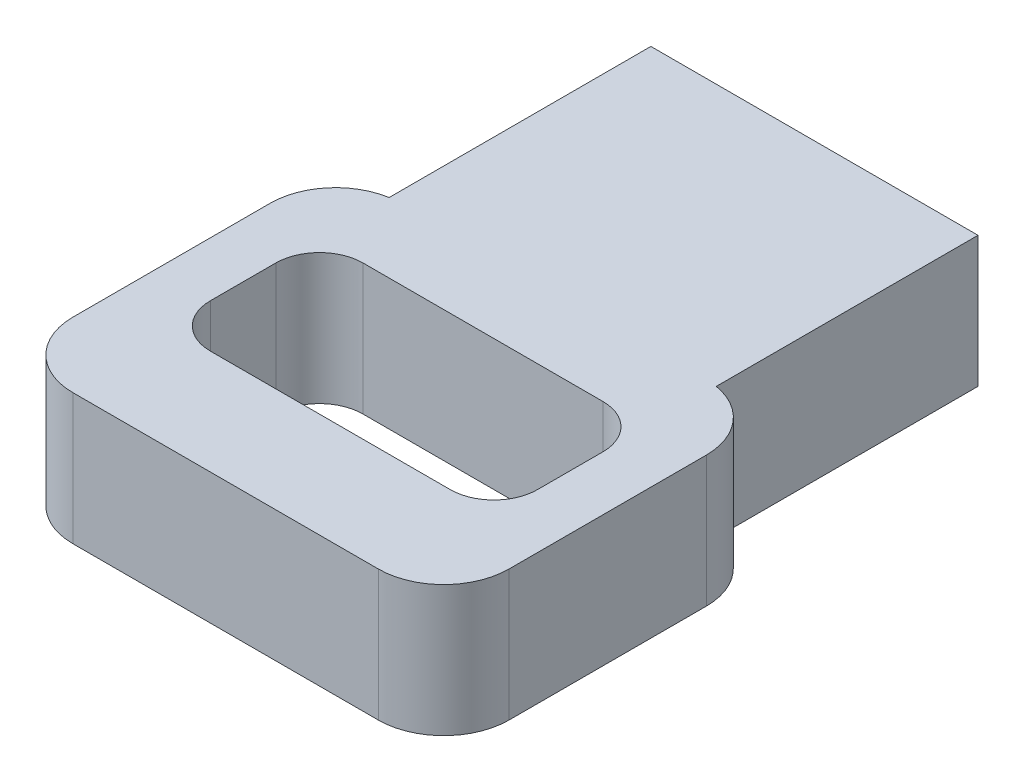
ISO-10303-21;
HEADER;
FILE_DESCRIPTION(('STEP AP214'),'2;1');
FILE_NAME('part.step','',(''),(''),'','','');
FILE_SCHEMA(('AUTOMOTIVE_DESIGN { 1 0 10303 214 1 1 1 1 }'));
ENDSEC;
DATA;
#1=APPLICATION_CONTEXT('core data for automotive mechanical design processes');
#2=APPLICATION_PROTOCOL_DEFINITION('international standard','automotive_design',2000,#1);
#3=PRODUCT_CONTEXT('',#1,'mechanical');
#4=PRODUCT('Part','Part','',(#3));
#5=PRODUCT_RELATED_PRODUCT_CATEGORY('part','',(#4));
#6=PRODUCT_DEFINITION_FORMATION('','',#4);
#7=PRODUCT_DEFINITION_CONTEXT('part definition',#1,'design');
#8=PRODUCT_DEFINITION('design','',#6,#7);
#9=PRODUCT_DEFINITION_SHAPE('','',#8);
#10=(LENGTH_UNIT() NAMED_UNIT(*) SI_UNIT(.MILLI.,.METRE.));
#11=(NAMED_UNIT(*) PLANE_ANGLE_UNIT() SI_UNIT($,.RADIAN.));
#12=(NAMED_UNIT(*) SI_UNIT($,.STERADIAN.) SOLID_ANGLE_UNIT());
#13=UNCERTAINTY_MEASURE_WITH_UNIT(LENGTH_MEASURE(1.E-05),#10,'distance_accuracy_value','');
#14=(GEOMETRIC_REPRESENTATION_CONTEXT(3) GLOBAL_UNCERTAINTY_ASSIGNED_CONTEXT((#13)) GLOBAL_UNIT_ASSIGNED_CONTEXT((#10,
#11,#12)) REPRESENTATION_CONTEXT('',''));
#15=CARTESIAN_POINT('',(0.,0.,0.));
#16=DIRECTION('',(0.,0.,1.));
#17=DIRECTION('',(1.,0.,0.));
#18=AXIS2_PLACEMENT_3D('',#15,#16,#17);
#19=CARTESIAN_POINT('',(-19.05,-7.62,30.48));
#20=DIRECTION('',(1.,0.,0.));
#21=DIRECTION('',(0.,0.,-1.));
#22=AXIS2_PLACEMENT_3D('',#19,#20,#21);
#23=PLANE('',#22);
#24=DIRECTION('',(0.,-1.,0.));
#25=VECTOR('',#24,1.);
#26=CARTESIAN_POINT('',(-19.05,-7.62,0.));
#27=LINE('',#26,#25);
#28=CARTESIAN_POINT('',(-19.05,7.62,0.));
#29=VERTEX_POINT('',#28);
#30=CARTESIAN_POINT('',(-19.05,-7.62,0.));
#31=VERTEX_POINT('',#30);
#32=EDGE_CURVE('E197',#29,#31,#27,.T.);
#33=ORIENTED_EDGE('',*,*,#32,.T.);
#34=DIRECTION('',(0.,0.,-1.));
#35=VECTOR('',#34,1.);
#36=CARTESIAN_POINT('',(-19.05,-7.62,30.48));
#37=LINE('',#36,#35);
#38=CARTESIAN_POINT('',(-19.05,-7.62,30.48));
#39=VERTEX_POINT('',#38);
#40=EDGE_CURVE('E205',#39,#31,#37,.T.);
#41=ORIENTED_EDGE('',*,*,#40,.F.);
#42=DIRECTION('',(0.,-1.,0.));
#43=VECTOR('',#42,1.);
#44=CARTESIAN_POINT('',(-19.05,-7.62,30.48));
#45=LINE('',#44,#43);
#46=CARTESIAN_POINT('',(-19.05,7.62,30.48));
#47=VERTEX_POINT('',#46);
#48=EDGE_CURVE('E188',#47,#39,#45,.T.);
#49=ORIENTED_EDGE('',*,*,#48,.F.);
#50=DIRECTION('',(0.,0.,-1.));
#51=VECTOR('',#50,1.);
#52=CARTESIAN_POINT('',(-19.05,7.62,30.48));
#53=LINE('',#52,#51);
#54=EDGE_CURVE('E184',#47,#29,#53,.T.);
#55=ORIENTED_EDGE('',*,*,#54,.T.);
#56=EDGE_LOOP('',(#33,#41,#49,#55));
#57=FACE_BOUND('',#56,.T.);
#58=ADVANCED_FACE('F43',(#57),#23,.F.);
#59=CARTESIAN_POINT('',(19.05,-7.62,30.48));
#60=DIRECTION('',(0.,1.,0.));
#61=DIRECTION('',(-1.,0.,0.));
#62=AXIS2_PLACEMENT_3D('',#59,#60,#61);
#63=PLANE('',#62);
#64=DIRECTION('',(1.,0.,0.));
#65=VECTOR('',#64,1.);
#66=CARTESIAN_POINT('',(-19.05,-7.62,38.604377682194));
#67=LINE('',#66,#65);
#68=CARTESIAN_POINT('',(-13.97,-7.62,38.604377682194));
#69=VERTEX_POINT('',#68);
#70=CARTESIAN_POINT('',(13.97,-7.62,38.604377682194));
#71=VERTEX_POINT('',#70);
#72=EDGE_CURVE('E554',#69,#71,#67,.T.);
#73=ORIENTED_EDGE('',*,*,#72,.F.);
#74=CARTESIAN_POINT('',(-13.97,-7.62,43.684377682194));
#75=DIRECTION('',(0.,1.,0.));
#76=DIRECTION('',(-1.,0.,0.));
#77=AXIS2_PLACEMENT_3D('',#74,#75,#76);
#78=CIRCLE('',#77,5.08);
#79=CARTESIAN_POINT('',(-19.05,-7.62,43.684377682194));
#80=VERTEX_POINT('',#79);
#81=EDGE_CURVE('E232',#69,#80,#78,.T.);
#82=ORIENTED_EDGE('',*,*,#81,.T.);
#83=DIRECTION('',(0.,0.,-1.));
#84=VECTOR('',#83,1.);
#85=CARTESIAN_POINT('',(-19.05,-7.62,56.384377682194));
#86=LINE('',#85,#84);
#87=CARTESIAN_POINT('',(-19.05,-7.62,51.304377682194));
#88=VERTEX_POINT('',#87);
#89=EDGE_CURVE('E548',#88,#80,#86,.T.);
#90=ORIENTED_EDGE('',*,*,#89,.F.);
#91=CARTESIAN_POINT('',(-13.97,-7.62,51.304377682194));
#92=DIRECTION('',(0.,1.,0.));
#93=DIRECTION('',(-1.,0.,0.));
#94=AXIS2_PLACEMENT_3D('',#91,#92,#93);
#95=CIRCLE('',#94,5.08);
#96=CARTESIAN_POINT('',(-13.97,-7.62,56.384377682194));
#97=VERTEX_POINT('',#96);
#98=EDGE_CURVE('E240',#88,#97,#95,.T.);
#99=ORIENTED_EDGE('',*,*,#98,.T.);
#100=DIRECTION('',(1.,0.,0.));
#101=VECTOR('',#100,1.);
#102=CARTESIAN_POINT('',(-19.05,-7.62,56.384377682194));
#103=LINE('',#102,#101);
#104=CARTESIAN_POINT('',(13.97,-7.62,56.384377682194));
#105=VERTEX_POINT('',#104);
#106=EDGE_CURVE('E562',#97,#105,#103,.T.);
#107=ORIENTED_EDGE('',*,*,#106,.T.);
#108=CARTESIAN_POINT('',(13.97,-7.62,51.304377682194));
#109=DIRECTION('',(0.,1.,0.));
#110=DIRECTION('',(-1.,0.,0.));
#111=AXIS2_PLACEMENT_3D('',#108,#109,#110);
#112=CIRCLE('',#111,5.08);
#113=CARTESIAN_POINT('',(19.05,-7.62,51.304377682194));
#114=VERTEX_POINT('',#113);
#115=EDGE_CURVE('E236',#105,#114,#112,.T.);
#116=ORIENTED_EDGE('',*,*,#115,.T.);
#117=DIRECTION('',(0.,0.,-1.));
#118=VECTOR('',#117,1.);
#119=CARTESIAN_POINT('',(19.05,-7.62,56.384377682194));
#120=LINE('',#119,#118);
#121=CARTESIAN_POINT('',(19.05,-7.62,43.684377682194));
#122=VERTEX_POINT('',#121);
#123=EDGE_CURVE('E557',#114,#122,#120,.T.);
#124=ORIENTED_EDGE('',*,*,#123,.T.);
#125=CARTESIAN_POINT('',(13.97,-7.62,43.684377682194));
#126=DIRECTION('',(0.,1.,0.));
#127=DIRECTION('',(-1.,0.,0.));
#128=AXIS2_PLACEMENT_3D('',#125,#126,#127);
#129=CIRCLE('',#128,5.08);
#130=EDGE_CURVE('E228',#122,#71,#129,.T.);
#131=ORIENTED_EDGE('',*,*,#130,.T.);
#132=EDGE_LOOP('',(#73,#82,#90,#99,#107,#116,#124,#131));
#133=FACE_BOUND('',#132,.T.);
#134=DIRECTION('',(0.,0.,-1.));
#135=VECTOR('',#134,1.);
#136=CARTESIAN_POINT('',(-25.4,-7.62,68.58));
#137=LINE('',#136,#135);
#138=CARTESIAN_POINT('',(-25.4,-7.62,60.96));
#139=VERTEX_POINT('',#138);
#140=CARTESIAN_POINT('',(-25.4,-7.62,37.9934213245365));
#141=VERTEX_POINT('',#140);
#142=EDGE_CURVE('E284',#139,#141,#137,.T.);
#143=ORIENTED_EDGE('',*,*,#142,.T.);
#144=CARTESIAN_POINT('',(-17.78,-7.62,37.9934213245365));
#145=DIRECTION('',(0.,1.,0.));
#146=DIRECTION('',(-1.,0.,0.));
#147=AXIS2_PLACEMENT_3D('',#144,#145,#146);
#148=CIRCLE('',#147,7.62);
#149=EDGE_CURVE('E254',#141,#39,#148,.F.);
#150=ORIENTED_EDGE('',*,*,#149,.T.);
#151=ORIENTED_EDGE('',*,*,#40,.T.);
#152=DIRECTION('',(1.,0.,0.));
#153=VECTOR('',#152,1.);
#154=CARTESIAN_POINT('',(19.05,-7.62,0.));
#155=LINE('',#154,#153);
#156=CARTESIAN_POINT('',(19.05,-7.62,0.));
#157=VERTEX_POINT('',#156);
#158=EDGE_CURVE('E200',#31,#157,#155,.T.);
#159=ORIENTED_EDGE('',*,*,#158,.T.);
#160=DIRECTION('',(0.,0.,-1.));
#161=VECTOR('',#160,1.);
#162=CARTESIAN_POINT('',(19.05,-7.62,30.48));
#163=LINE('',#162,#161);
#164=CARTESIAN_POINT('',(19.05,-7.62,30.48));
#165=VERTEX_POINT('',#164);
#166=EDGE_CURVE('E183',#165,#157,#163,.T.);
#167=ORIENTED_EDGE('',*,*,#166,.F.);
#168=CARTESIAN_POINT('',(17.78,-7.62,37.9934213245365));
#169=DIRECTION('',(0.,1.,0.));
#170=DIRECTION('',(-1.,0.,0.));
#171=AXIS2_PLACEMENT_3D('',#168,#169,#170);
#172=CIRCLE('',#171,7.62);
#173=CARTESIAN_POINT('',(25.4,-7.62,37.9934213245365));
#174=VERTEX_POINT('',#173);
#175=EDGE_CURVE('E187',#165,#174,#172,.F.);
#176=ORIENTED_EDGE('',*,*,#175,.T.);
#177=DIRECTION('',(0.,0.,-1.));
#178=VECTOR('',#177,1.);
#179=CARTESIAN_POINT('',(25.4,-7.62,68.58));
#180=LINE('',#179,#178);
#181=CARTESIAN_POINT('',(25.4,-7.62,60.96));
#182=VERTEX_POINT('',#181);
#183=EDGE_CURVE('E281',#182,#174,#180,.T.);
#184=ORIENTED_EDGE('',*,*,#183,.F.);
#185=CARTESIAN_POINT('',(17.78,-7.62,60.96));
#186=DIRECTION('',(0.,1.,0.));
#187=DIRECTION('',(-1.,0.,0.));
#188=AXIS2_PLACEMENT_3D('',#185,#186,#187);
#189=CIRCLE('',#188,7.62);
#190=CARTESIAN_POINT('',(17.78,-7.62,68.58));
#191=VERTEX_POINT('',#190);
#192=EDGE_CURVE('E251',#182,#191,#189,.F.);
#193=ORIENTED_EDGE('',*,*,#192,.T.);
#194=DIRECTION('',(1.,0.,0.));
#195=VECTOR('',#194,1.);
#196=CARTESIAN_POINT('',(-25.4,-7.62,68.58));
#197=LINE('',#196,#195);
#198=CARTESIAN_POINT('',(-17.78,-7.62,68.58));
#199=VERTEX_POINT('',#198);
#200=EDGE_CURVE('E270',#199,#191,#197,.T.);
#201=ORIENTED_EDGE('',*,*,#200,.F.);
#202=CARTESIAN_POINT('',(-17.78,-7.62,60.96));
#203=DIRECTION('',(0.,1.,0.));
#204=DIRECTION('',(-1.,0.,0.));
#205=AXIS2_PLACEMENT_3D('',#202,#203,#204);
#206=CIRCLE('',#205,7.62);
#207=EDGE_CURVE('E249',#199,#139,#206,.F.);
#208=ORIENTED_EDGE('',*,*,#207,.T.);
#209=EDGE_LOOP('',(#143,#150,#151,#159,#167,#176,#184,#193,#201,#208));
#210=FACE_BOUND('',#209,.T.);
#211=ADVANCED_FACE('F277',(#133,#210),#63,.F.);
#212=CARTESIAN_POINT('',(19.05,-7.62,30.48));
#213=DIRECTION('',(-1.,0.,0.));
#214=DIRECTION('',(0.,0.,1.));
#215=AXIS2_PLACEMENT_3D('',#212,#213,#214);
#216=PLANE('',#215);
#217=DIRECTION('',(0.,1.,0.));
#218=VECTOR('',#217,1.);
#219=CARTESIAN_POINT('',(19.05,-7.62,0.));
#220=LINE('',#219,#218);
#221=CARTESIAN_POINT('',(19.05,7.62,0.));
#222=VERTEX_POINT('',#221);
#223=EDGE_CURVE('E182',#157,#222,#220,.T.);
#224=ORIENTED_EDGE('',*,*,#223,.T.);
#225=DIRECTION('',(0.,0.,-1.));
#226=VECTOR('',#225,1.);
#227=CARTESIAN_POINT('',(19.05,7.62,30.48));
#228=LINE('',#227,#226);
#229=CARTESIAN_POINT('',(19.05,7.62,30.48));
#230=VERTEX_POINT('',#229);
#231=EDGE_CURVE('E170',#230,#222,#228,.T.);
#232=ORIENTED_EDGE('',*,*,#231,.F.);
#233=DIRECTION('',(0.,1.,0.));
#234=VECTOR('',#233,1.);
#235=CARTESIAN_POINT('',(19.05,-7.62,30.48));
#236=LINE('',#235,#234);
#237=EDGE_CURVE('E179',#165,#230,#236,.T.);
#238=ORIENTED_EDGE('',*,*,#237,.F.);
#239=ORIENTED_EDGE('',*,*,#166,.T.);
#240=EDGE_LOOP('',(#224,#232,#238,#239));
#241=FACE_BOUND('',#240,.T.);
#242=ADVANCED_FACE('F177',(#241),#216,.F.);
#243=CARTESIAN_POINT('',(19.05,7.62,30.48));
#244=DIRECTION('',(0.,-1.,0.));
#245=DIRECTION('',(1.,0.,0.));
#246=AXIS2_PLACEMENT_3D('',#243,#244,#245);
#247=PLANE('',#246);
#248=DIRECTION('',(1.,0.,0.));
#249=VECTOR('',#248,1.);
#250=CARTESIAN_POINT('',(-19.05,7.62,56.384377682194));
#251=LINE('',#250,#249);
#252=CARTESIAN_POINT('',(-13.97,7.62,56.384377682194));
#253=VERTEX_POINT('',#252);
#254=CARTESIAN_POINT('',(13.97,7.62,56.384377682194));
#255=VERTEX_POINT('',#254);
#256=EDGE_CURVE('E286',#253,#255,#251,.T.);
#257=ORIENTED_EDGE('',*,*,#256,.F.);
#258=CARTESIAN_POINT('',(-13.97,7.62,51.304377682194));
#259=DIRECTION('',(0.,-1.,0.));
#260=DIRECTION('',(1.,0.,0.));
#261=AXIS2_PLACEMENT_3D('',#258,#259,#260);
#262=CIRCLE('',#261,5.08);
#263=CARTESIAN_POINT('',(-19.05,7.62,51.304377682194));
#264=VERTEX_POINT('',#263);
#265=EDGE_CURVE('E242',#253,#264,#262,.T.);
#266=ORIENTED_EDGE('',*,*,#265,.T.);
#267=DIRECTION('',(0.,0.,-1.));
#268=VECTOR('',#267,1.);
#269=CARTESIAN_POINT('',(-19.05,7.62,56.384377682194));
#270=LINE('',#269,#268);
#271=CARTESIAN_POINT('',(-19.05,7.62,43.684377682194));
#272=VERTEX_POINT('',#271);
#273=EDGE_CURVE('E550',#264,#272,#270,.T.);
#274=ORIENTED_EDGE('',*,*,#273,.T.);
#275=CARTESIAN_POINT('',(-13.97,7.62,43.684377682194));
#276=DIRECTION('',(0.,-1.,0.));
#277=DIRECTION('',(1.,0.,0.));
#278=AXIS2_PLACEMENT_3D('',#275,#276,#277);
#279=CIRCLE('',#278,5.08);
#280=CARTESIAN_POINT('',(-13.97,7.62,38.604377682194));
#281=VERTEX_POINT('',#280);
#282=EDGE_CURVE('E234',#272,#281,#279,.T.);
#283=ORIENTED_EDGE('',*,*,#282,.T.);
#284=DIRECTION('',(1.,0.,0.));
#285=VECTOR('',#284,1.);
#286=CARTESIAN_POINT('',(-19.05,7.62,38.604377682194));
#287=LINE('',#286,#285);
#288=CARTESIAN_POINT('',(13.97,7.62000000000001,38.604377682194));
#289=VERTEX_POINT('',#288);
#290=EDGE_CURVE('E563',#281,#289,#287,.T.);
#291=ORIENTED_EDGE('',*,*,#290,.T.);
#292=CARTESIAN_POINT('',(13.97,7.62,43.684377682194));
#293=DIRECTION('',(0.,-1.,0.));
#294=DIRECTION('',(1.,0.,0.));
#295=AXIS2_PLACEMENT_3D('',#292,#293,#294);
#296=CIRCLE('',#295,5.08);
#297=CARTESIAN_POINT('',(19.05,7.62000000000001,43.684377682194));
#298=VERTEX_POINT('',#297);
#299=EDGE_CURVE('E230',#289,#298,#296,.T.);
#300=ORIENTED_EDGE('',*,*,#299,.T.);
#301=DIRECTION('',(0.,0.,-1.));
#302=VECTOR('',#301,1.);
#303=CARTESIAN_POINT('',(19.05,7.62000000000001,56.384377682194));
#304=LINE('',#303,#302);
#305=CARTESIAN_POINT('',(19.05,7.62000000000001,51.304377682194));
#306=VERTEX_POINT('',#305);
#307=EDGE_CURVE('E542',#306,#298,#304,.T.);
#308=ORIENTED_EDGE('',*,*,#307,.F.);
#309=CARTESIAN_POINT('',(13.97,7.62,51.304377682194));
#310=DIRECTION('',(0.,-1.,0.));
#311=DIRECTION('',(1.,0.,0.));
#312=AXIS2_PLACEMENT_3D('',#309,#310,#311);
#313=CIRCLE('',#312,5.08);
#314=EDGE_CURVE('E238',#306,#255,#313,.T.);
#315=ORIENTED_EDGE('',*,*,#314,.T.);
#316=EDGE_LOOP('',(#257,#266,#274,#283,#291,#300,#308,#315));
#317=FACE_BOUND('',#316,.T.);
#318=ORIENTED_EDGE('',*,*,#54,.F.);
#319=CARTESIAN_POINT('',(-17.78,7.62,37.9934213245365));
#320=DIRECTION('',(0.,-1.,0.));
#321=DIRECTION('',(1.,0.,0.));
#322=AXIS2_PLACEMENT_3D('',#319,#320,#321);
#323=CIRCLE('',#322,7.62);
#324=CARTESIAN_POINT('',(-25.4,7.62,37.9934213245365));
#325=VERTEX_POINT('',#324);
#326=EDGE_CURVE('E173',#47,#325,#323,.F.);
#327=ORIENTED_EDGE('',*,*,#326,.T.);
#328=DIRECTION('',(0.,0.,-1.));
#329=VECTOR('',#328,1.);
#330=CARTESIAN_POINT('',(-25.4,7.62,68.58));
#331=LINE('',#330,#329);
#332=CARTESIAN_POINT('',(-25.4,7.62,60.96));
#333=VERTEX_POINT('',#332);
#334=EDGE_CURVE('E291',#333,#325,#331,.T.);
#335=ORIENTED_EDGE('',*,*,#334,.F.);
#336=CARTESIAN_POINT('',(-17.78,7.62,60.96));
#337=DIRECTION('',(0.,-1.,0.));
#338=DIRECTION('',(1.,0.,0.));
#339=AXIS2_PLACEMENT_3D('',#336,#337,#338);
#340=CIRCLE('',#339,7.62);
#341=CARTESIAN_POINT('',(-17.78,7.62,68.58));
#342=VERTEX_POINT('',#341);
#343=EDGE_CURVE('E256',#333,#342,#340,.F.);
#344=ORIENTED_EDGE('',*,*,#343,.T.);
#345=DIRECTION('',(-1.,0.,0.));
#346=VECTOR('',#345,1.);
#347=CARTESIAN_POINT('',(-25.4,7.62,68.58));
#348=LINE('',#347,#346);
#349=CARTESIAN_POINT('',(17.78,7.62,68.58));
#350=VERTEX_POINT('',#349);
#351=EDGE_CURVE('E272',#350,#342,#348,.T.);
#352=ORIENTED_EDGE('',*,*,#351,.F.);
#353=CARTESIAN_POINT('',(17.78,7.62,60.96));
#354=DIRECTION('',(0.,-1.,0.));
#355=DIRECTION('',(1.,0.,0.));
#356=AXIS2_PLACEMENT_3D('',#353,#354,#355);
#357=CIRCLE('',#356,7.62);
#358=CARTESIAN_POINT('',(25.4,7.62,60.96));
#359=VERTEX_POINT('',#358);
#360=EDGE_CURVE('E66',#350,#359,#357,.F.);
#361=ORIENTED_EDGE('',*,*,#360,.T.);
#362=DIRECTION('',(0.,0.,-1.));
#363=VECTOR('',#362,1.);
#364=CARTESIAN_POINT('',(25.4,7.62,68.58));
#365=LINE('',#364,#363);
#366=CARTESIAN_POINT('',(25.4,7.62,37.9934213245365));
#367=VERTEX_POINT('',#366);
#368=EDGE_CURVE('E172',#359,#367,#365,.T.);
#369=ORIENTED_EDGE('',*,*,#368,.T.);
#370=CARTESIAN_POINT('',(17.78,7.62,37.9934213245365));
#371=DIRECTION('',(0.,-1.,0.));
#372=DIRECTION('',(1.,0.,0.));
#373=AXIS2_PLACEMENT_3D('',#370,#371,#372);
#374=CIRCLE('',#373,7.62);
#375=EDGE_CURVE('E58',#367,#230,#374,.F.);
#376=ORIENTED_EDGE('',*,*,#375,.T.);
#377=ORIENTED_EDGE('',*,*,#231,.T.);
#378=DIRECTION('',(-1.,0.,0.));
#379=VECTOR('',#378,1.);
#380=CARTESIAN_POINT('',(19.05,7.62,0.));
#381=LINE('',#380,#379);
#382=EDGE_CURVE('E193',#222,#29,#381,.T.);
#383=ORIENTED_EDGE('',*,*,#382,.T.);
#384=EDGE_LOOP('',(#318,#327,#335,#344,#352,#361,#369,#376,#377,#383));
#385=FACE_BOUND('',#384,.T.);
#386=ADVANCED_FACE('F169',(#317,#385),#247,.F.);
#387=CARTESIAN_POINT('',(0.,0.,0.));
#388=DIRECTION('',(0.,0.,1.));
#389=DIRECTION('',(1.,0.,0.));
#390=AXIS2_PLACEMENT_3D('',#387,#388,#389);
#391=PLANE('',#390);
#392=ORIENTED_EDGE('',*,*,#32,.F.);
#393=ORIENTED_EDGE('',*,*,#382,.F.);
#394=ORIENTED_EDGE('',*,*,#223,.F.);
#395=ORIENTED_EDGE('',*,*,#158,.F.);
#396=EDGE_LOOP('',(#392,#393,#394,#395));
#397=FACE_BOUND('',#396,.T.);
#398=ADVANCED_FACE('F306',(#397),#391,.F.);
#399=CARTESIAN_POINT('',(25.4,-7.62,68.58));
#400=DIRECTION('',(-1.,0.,0.));
#401=DIRECTION('',(0.,0.,1.));
#402=AXIS2_PLACEMENT_3D('',#399,#400,#401);
#403=PLANE('',#402);
#404=ORIENTED_EDGE('',*,*,#183,.T.);
#405=DIRECTION('',(0.,1.,0.));
#406=VECTOR('',#405,1.);
#407=CARTESIAN_POINT('',(25.4,-7.62,37.9934213245365));
#408=LINE('',#407,#406);
#409=EDGE_CURVE('E262',#174,#367,#408,.T.);
#410=ORIENTED_EDGE('',*,*,#409,.T.);
#411=ORIENTED_EDGE('',*,*,#368,.F.);
#412=DIRECTION('',(0.,1.,0.));
#413=VECTOR('',#412,1.);
#414=CARTESIAN_POINT('',(25.4,-7.62,60.96));
#415=LINE('',#414,#413);
#416=EDGE_CURVE('E260',#359,#182,#415,.F.);
#417=ORIENTED_EDGE('',*,*,#416,.T.);
#418=EDGE_LOOP('',(#404,#410,#411,#417));
#419=FACE_BOUND('',#418,.T.);
#420=ADVANCED_FACE('F308',(#419),#403,.F.);
#421=CARTESIAN_POINT('',(-25.4,-7.62,68.58));
#422=DIRECTION('',(1.,0.,0.));
#423=DIRECTION('',(0.,0.,-1.));
#424=AXIS2_PLACEMENT_3D('',#421,#422,#423);
#425=PLANE('',#424);
#426=ORIENTED_EDGE('',*,*,#334,.T.);
#427=DIRECTION('',(0.,-1.,0.));
#428=VECTOR('',#427,1.);
#429=CARTESIAN_POINT('',(-25.4,-7.62,37.9934213245365));
#430=LINE('',#429,#428);
#431=EDGE_CURVE('E246',#325,#141,#430,.T.);
#432=ORIENTED_EDGE('',*,*,#431,.T.);
#433=ORIENTED_EDGE('',*,*,#142,.F.);
#434=DIRECTION('',(0.,-1.,0.));
#435=VECTOR('',#434,1.);
#436=CARTESIAN_POINT('',(-25.4,-7.62,60.96));
#437=LINE('',#436,#435);
#438=EDGE_CURVE('E244',#139,#333,#437,.F.);
#439=ORIENTED_EDGE('',*,*,#438,.T.);
#440=EDGE_LOOP('',(#426,#432,#433,#439));
#441=FACE_BOUND('',#440,.T.);
#442=ADVANCED_FACE('F296',(#441),#425,.F.);
#443=CARTESIAN_POINT('',(0.,0.,68.58));
#444=DIRECTION('',(0.,0.,-1.));
#445=DIRECTION('',(-1.,0.,0.));
#446=AXIS2_PLACEMENT_3D('',#443,#444,#445);
#447=PLANE('',#446);
#448=ORIENTED_EDGE('',*,*,#200,.T.);
#449=DIRECTION('',(0.,1.,0.));
#450=VECTOR('',#449,1.);
#451=CARTESIAN_POINT('',(17.78,0.,68.58));
#452=LINE('',#451,#450);
#453=EDGE_CURVE('E11',#191,#350,#452,.T.);
#454=ORIENTED_EDGE('',*,*,#453,.T.);
#455=ORIENTED_EDGE('',*,*,#351,.T.);
#456=DIRECTION('',(0.,-1.,0.));
#457=VECTOR('',#456,1.);
#458=CARTESIAN_POINT('',(-17.78,0.,68.58));
#459=LINE('',#458,#457);
#460=EDGE_CURVE('E51',#342,#199,#459,.T.);
#461=ORIENTED_EDGE('',*,*,#460,.T.);
#462=EDGE_LOOP('',(#448,#454,#455,#461));
#463=FACE_BOUND('',#462,.T.);
#464=ADVANCED_FACE('F269',(#463),#447,.F.);
#465=CARTESIAN_POINT('',(-19.05,7.62,56.384377682194));
#466=DIRECTION('',(-1.,0.,0.));
#467=DIRECTION('',(0.,-1.,0.));
#468=AXIS2_PLACEMENT_3D('',#465,#466,#467);
#469=PLANE('',#468);
#470=ORIENTED_EDGE('',*,*,#89,.T.);
#471=DIRECTION('',(0.,-1.,0.));
#472=VECTOR('',#471,1.);
#473=CARTESIAN_POINT('',(-19.05,7.62,43.684377682194));
#474=LINE('',#473,#472);
#475=EDGE_CURVE('E221',#80,#272,#474,.F.);
#476=ORIENTED_EDGE('',*,*,#475,.T.);
#477=ORIENTED_EDGE('',*,*,#273,.F.);
#478=DIRECTION('',(0.,-1.,0.));
#479=VECTOR('',#478,1.);
#480=CARTESIAN_POINT('',(-19.05,7.62,51.304377682194));
#481=LINE('',#480,#479);
#482=EDGE_CURVE('E218',#264,#88,#481,.T.);
#483=ORIENTED_EDGE('',*,*,#482,.T.);
#484=EDGE_LOOP('',(#470,#476,#477,#483));
#485=FACE_BOUND('',#484,.T.);
#486=ADVANCED_FACE('F423',(#485),#469,.F.);
#487=CARTESIAN_POINT('',(-19.05,7.62,56.384377682194));
#488=DIRECTION('',(0.,0.,-1.));
#489=DIRECTION('',(-1.,0.,0.));
#490=AXIS2_PLACEMENT_3D('',#487,#488,#489);
#491=PLANE('',#490);
#492=ORIENTED_EDGE('',*,*,#256,.T.);
#493=DIRECTION('',(0.,-1.,0.));
#494=VECTOR('',#493,1.);
#495=CARTESIAN_POINT('',(13.97,-7.62,56.384377682194));
#496=LINE('',#495,#494);
#497=EDGE_CURVE('E225',#255,#105,#496,.T.);
#498=ORIENTED_EDGE('',*,*,#497,.T.);
#499=ORIENTED_EDGE('',*,*,#106,.F.);
#500=DIRECTION('',(0.,-1.,0.));
#501=VECTOR('',#500,1.);
#502=CARTESIAN_POINT('',(-13.97,7.62,56.384377682194));
#503=LINE('',#502,#501);
#504=EDGE_CURVE('E223',#97,#253,#503,.F.);
#505=ORIENTED_EDGE('',*,*,#504,.T.);
#506=EDGE_LOOP('',(#492,#498,#499,#505));
#507=FACE_BOUND('',#506,.T.);
#508=ADVANCED_FACE('F413',(#507),#491,.T.);
#509=CARTESIAN_POINT('',(19.05,7.62000000000001,56.384377682194));
#510=DIRECTION('',(-1.,0.,0.));
#511=DIRECTION('',(0.,0.,1.));
#512=AXIS2_PLACEMENT_3D('',#509,#510,#511);
#513=PLANE('',#512);
#514=ORIENTED_EDGE('',*,*,#307,.T.);
#515=DIRECTION('',(0.,-1.,0.));
#516=VECTOR('',#515,1.);
#517=CARTESIAN_POINT('',(19.05,7.62000000000001,43.684377682194));
#518=LINE('',#517,#516);
#519=EDGE_CURVE('E210',#298,#122,#518,.T.);
#520=ORIENTED_EDGE('',*,*,#519,.T.);
#521=ORIENTED_EDGE('',*,*,#123,.F.);
#522=DIRECTION('',(0.,-1.,0.));
#523=VECTOR('',#522,1.);
#524=CARTESIAN_POINT('',(19.05,7.62000000000001,51.304377682194));
#525=LINE('',#524,#523);
#526=EDGE_CURVE('E208',#114,#306,#525,.F.);
#527=ORIENTED_EDGE('',*,*,#526,.T.);
#528=EDGE_LOOP('',(#514,#520,#521,#527));
#529=FACE_BOUND('',#528,.T.);
#530=ADVANCED_FACE('F403',(#529),#513,.T.);
#531=CARTESIAN_POINT('',(-19.05,7.62,38.604377682194));
#532=DIRECTION('',(0.,0.,-1.));
#533=DIRECTION('',(-1.,0.,0.));
#534=AXIS2_PLACEMENT_3D('',#531,#532,#533);
#535=PLANE('',#534);
#536=ORIENTED_EDGE('',*,*,#72,.T.);
#537=DIRECTION('',(0.,-1.,0.));
#538=VECTOR('',#537,1.);
#539=CARTESIAN_POINT('',(13.97,7.62,38.604377682194));
#540=LINE('',#539,#538);
#541=EDGE_CURVE('E216',#71,#289,#540,.F.);
#542=ORIENTED_EDGE('',*,*,#541,.T.);
#543=ORIENTED_EDGE('',*,*,#290,.F.);
#544=DIRECTION('',(0.,-1.,0.));
#545=VECTOR('',#544,1.);
#546=CARTESIAN_POINT('',(-13.97,-7.62,38.604377682194));
#547=LINE('',#546,#545);
#548=EDGE_CURVE('E213',#281,#69,#547,.T.);
#549=ORIENTED_EDGE('',*,*,#548,.T.);
#550=EDGE_LOOP('',(#536,#542,#543,#549));
#551=FACE_BOUND('',#550,.T.);
#552=ADVANCED_FACE('F329',(#551),#535,.F.);
#553=CARTESIAN_POINT('',(13.97,7.62,43.684377682194));
#554=DIRECTION('',(0.,-1.,0.));
#555=DIRECTION('',(1.,0.,0.));
#556=AXIS2_PLACEMENT_3D('',#553,#554,#555);
#557=CYLINDRICAL_SURFACE('',#556,5.08);
#558=ORIENTED_EDGE('',*,*,#299,.F.);
#559=ORIENTED_EDGE('',*,*,#541,.F.);
#560=ORIENTED_EDGE('',*,*,#130,.F.);
#561=ORIENTED_EDGE('',*,*,#519,.F.);
#562=EDGE_LOOP('',(#558,#559,#560,#561));
#563=FACE_BOUND('',#562,.T.);
#564=ADVANCED_FACE('F325',(#563),#557,.F.);
#565=CARTESIAN_POINT('',(-13.97,7.62,43.684377682194));
#566=DIRECTION('',(0.,1.,0.));
#567=DIRECTION('',(-1.,0.,0.));
#568=AXIS2_PLACEMENT_3D('',#565,#566,#567);
#569=CYLINDRICAL_SURFACE('',#568,5.08);
#570=ORIENTED_EDGE('',*,*,#282,.F.);
#571=ORIENTED_EDGE('',*,*,#475,.F.);
#572=ORIENTED_EDGE('',*,*,#81,.F.);
#573=ORIENTED_EDGE('',*,*,#548,.F.);
#574=EDGE_LOOP('',(#570,#571,#572,#573));
#575=FACE_BOUND('',#574,.T.);
#576=ADVANCED_FACE('F328',(#575),#569,.F.);
#577=CARTESIAN_POINT('',(13.97,7.62,51.304377682194));
#578=DIRECTION('',(0.,1.,0.));
#579=DIRECTION('',(-1.,0.,0.));
#580=AXIS2_PLACEMENT_3D('',#577,#578,#579);
#581=CYLINDRICAL_SURFACE('',#580,5.08);
#582=ORIENTED_EDGE('',*,*,#314,.F.);
#583=ORIENTED_EDGE('',*,*,#526,.F.);
#584=ORIENTED_EDGE('',*,*,#115,.F.);
#585=ORIENTED_EDGE('',*,*,#497,.F.);
#586=EDGE_LOOP('',(#582,#583,#584,#585));
#587=FACE_BOUND('',#586,.T.);
#588=ADVANCED_FACE('F333',(#587),#581,.F.);
#589=CARTESIAN_POINT('',(-13.97,7.62,51.304377682194));
#590=DIRECTION('',(0.,-1.,0.));
#591=DIRECTION('',(1.,0.,0.));
#592=AXIS2_PLACEMENT_3D('',#589,#590,#591);
#593=CYLINDRICAL_SURFACE('',#592,5.08);
#594=ORIENTED_EDGE('',*,*,#265,.F.);
#595=ORIENTED_EDGE('',*,*,#504,.F.);
#596=ORIENTED_EDGE('',*,*,#98,.F.);
#597=ORIENTED_EDGE('',*,*,#482,.F.);
#598=EDGE_LOOP('',(#594,#595,#596,#597));
#599=FACE_BOUND('',#598,.T.);
#600=ADVANCED_FACE('F337',(#599),#593,.F.);
#601=CARTESIAN_POINT('',(-17.78,0.,37.9934213245365));
#602=DIRECTION('',(0.,-1.,0.));
#603=DIRECTION('',(0.,0.,-1.));
#604=AXIS2_PLACEMENT_3D('',#601,#602,#603);
#605=CYLINDRICAL_SURFACE('',#604,7.62);
#606=ORIENTED_EDGE('',*,*,#326,.F.);
#607=ORIENTED_EDGE('',*,*,#48,.T.);
#608=ORIENTED_EDGE('',*,*,#149,.F.);
#609=ORIENTED_EDGE('',*,*,#431,.F.);
#610=EDGE_LOOP('',(#606,#607,#608,#609));
#611=FACE_BOUND('',#610,.T.);
#612=ADVANCED_FACE('F300',(#611),#605,.T.);
#613=CARTESIAN_POINT('',(17.78,0.,37.9934213245365));
#614=DIRECTION('',(0.,1.,0.));
#615=DIRECTION('',(0.,0.,1.));
#616=AXIS2_PLACEMENT_3D('',#613,#614,#615);
#617=CYLINDRICAL_SURFACE('',#616,7.62);
#618=ORIENTED_EDGE('',*,*,#175,.F.);
#619=ORIENTED_EDGE('',*,*,#237,.T.);
#620=ORIENTED_EDGE('',*,*,#375,.F.);
#621=ORIENTED_EDGE('',*,*,#409,.F.);
#622=EDGE_LOOP('',(#618,#619,#620,#621));
#623=FACE_BOUND('',#622,.T.);
#624=ADVANCED_FACE('F186',(#623),#617,.T.);
#625=CARTESIAN_POINT('',(17.78,0.,60.96));
#626=DIRECTION('',(0.,1.,0.));
#627=DIRECTION('',(0.,0.,1.));
#628=AXIS2_PLACEMENT_3D('',#625,#626,#627);
#629=CYLINDRICAL_SURFACE('',#628,7.62);
#630=ORIENTED_EDGE('',*,*,#192,.F.);
#631=ORIENTED_EDGE('',*,*,#416,.F.);
#632=ORIENTED_EDGE('',*,*,#360,.F.);
#633=ORIENTED_EDGE('',*,*,#453,.F.);
#634=EDGE_LOOP('',(#630,#631,#632,#633));
#635=FACE_BOUND('',#634,.T.);
#636=ADVANCED_FACE('F311',(#635),#629,.T.);
#637=CARTESIAN_POINT('',(-17.78,0.,60.96));
#638=DIRECTION('',(0.,-1.,0.));
#639=DIRECTION('',(0.,0.,-1.));
#640=AXIS2_PLACEMENT_3D('',#637,#638,#639);
#641=CYLINDRICAL_SURFACE('',#640,7.62);
#642=ORIENTED_EDGE('',*,*,#343,.F.);
#643=ORIENTED_EDGE('',*,*,#438,.F.);
#644=ORIENTED_EDGE('',*,*,#207,.F.);
#645=ORIENTED_EDGE('',*,*,#460,.F.);
#646=EDGE_LOOP('',(#642,#643,#644,#645));
#647=FACE_BOUND('',#646,.T.);
#648=ADVANCED_FACE('F45',(#647),#641,.T.);
#649=CLOSED_SHELL('',(#58,#211,#242,#386,#398,#420,#442,#464,#486,#508,#530,#552,#564,#576,#588,
#600,#612,#624,#636,#648));
#650=MANIFOLD_SOLID_BREP('B2',#649);
#651=ADVANCED_BREP_SHAPE_REPRESENTATION('',(#18,#650),#14);
#652=SHAPE_DEFINITION_REPRESENTATION(#9,#651);
ENDSEC;
END-ISO-10303-21;
